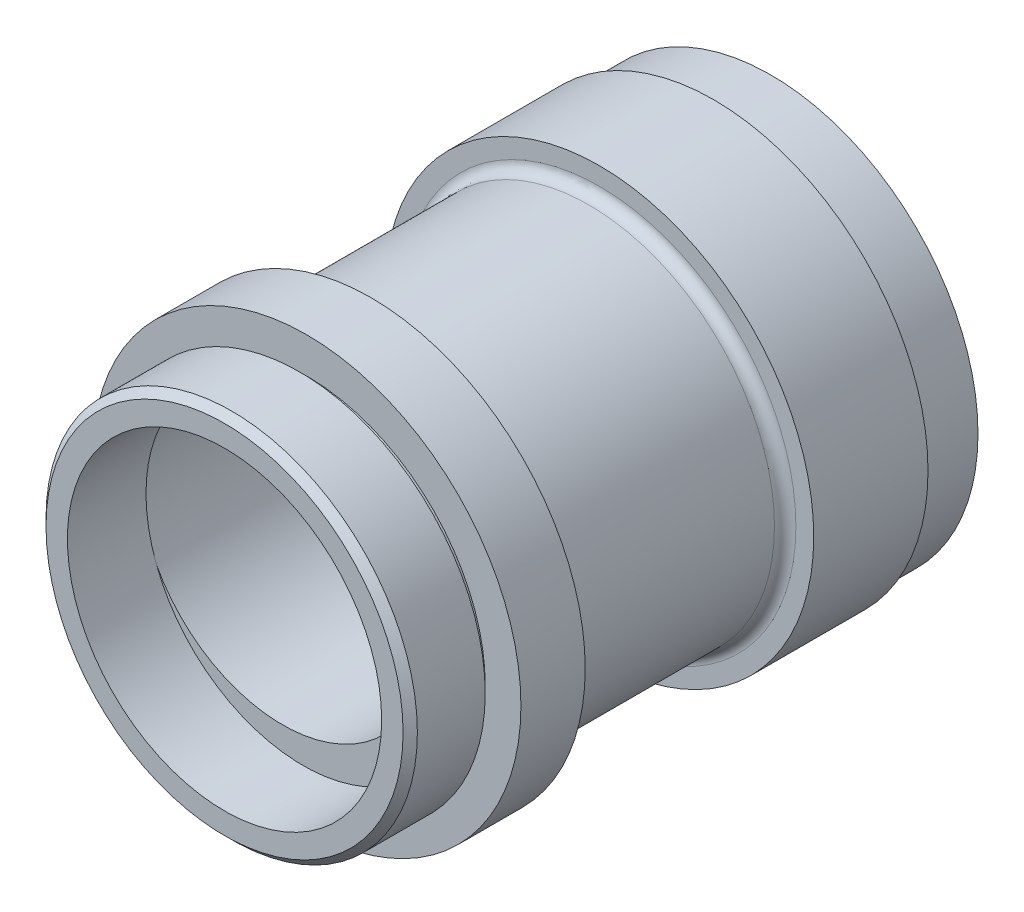
ISO-10303-21;
HEADER;
FILE_DESCRIPTION(('STEP AP214'),'2;1');
FILE_NAME('part.step','',(''),(''),'','','');
FILE_SCHEMA(('AUTOMOTIVE_DESIGN { 1 0 10303 214 1 1 1 1 }'));
ENDSEC;
DATA;
#1=APPLICATION_CONTEXT('core data for automotive mechanical design processes');
#2=APPLICATION_PROTOCOL_DEFINITION('international standard','automotive_design',2000,#1);
#3=PRODUCT_CONTEXT('',#1,'mechanical');
#4=PRODUCT('Part','Part','',(#3));
#5=PRODUCT_RELATED_PRODUCT_CATEGORY('part','',(#4));
#6=PRODUCT_DEFINITION_FORMATION('','',#4);
#7=PRODUCT_DEFINITION_CONTEXT('part definition',#1,'design');
#8=PRODUCT_DEFINITION('design','',#6,#7);
#9=PRODUCT_DEFINITION_SHAPE('','',#8);
#10=(LENGTH_UNIT() NAMED_UNIT(*) SI_UNIT(.MILLI.,.METRE.));
#11=(NAMED_UNIT(*) PLANE_ANGLE_UNIT() SI_UNIT($,.RADIAN.));
#12=(NAMED_UNIT(*) SI_UNIT($,.STERADIAN.) SOLID_ANGLE_UNIT());
#13=UNCERTAINTY_MEASURE_WITH_UNIT(LENGTH_MEASURE(1.E-05),#10,'distance_accuracy_value','');
#14=(GEOMETRIC_REPRESENTATION_CONTEXT(3) GLOBAL_UNCERTAINTY_ASSIGNED_CONTEXT((#13)) GLOBAL_UNIT_ASSIGNED_CONTEXT((#10,
#11,#12)) REPRESENTATION_CONTEXT('',''));
#15=CARTESIAN_POINT('',(0.,0.,0.));
#16=DIRECTION('',(0.,0.,1.));
#17=DIRECTION('',(1.,0.,0.));
#18=AXIS2_PLACEMENT_3D('',#15,#16,#17);
#19=CARTESIAN_POINT('',(0.,0.,4.));
#20=DIRECTION('',(0.,0.,-1.));
#21=DIRECTION('',(-1.,0.,0.));
#22=AXIS2_PLACEMENT_3D('',#19,#20,#21);
#23=CYLINDRICAL_SURFACE('',#22,14.5);
#24=CARTESIAN_POINT('',(0.,0.,4.));
#25=DIRECTION('',(0.,0.,1.));
#26=DIRECTION('',(1.,0.,0.));
#27=AXIS2_PLACEMENT_3D('',#24,#25,#26);
#28=CIRCLE('',#27,14.5);
#29=CARTESIAN_POINT('',(14.5,0.,4.));
#30=VERTEX_POINT('',#29);
#31=EDGE_CURVE('E107',#30,#30,#28,.T.);
#32=ORIENTED_EDGE('',*,*,#31,.F.);
#33=EDGE_LOOP('',(#32));
#34=FACE_BOUND('',#33,.T.);
#35=CARTESIAN_POINT('',(0.,0.,0.));
#36=DIRECTION('',(0.,0.,1.));
#37=DIRECTION('',(1.,0.,0.));
#38=AXIS2_PLACEMENT_3D('',#35,#36,#37);
#39=CIRCLE('',#38,14.5);
#40=CARTESIAN_POINT('',(14.5,0.,0.));
#41=VERTEX_POINT('',#40);
#42=EDGE_CURVE('E117',#41,#41,#39,.T.);
#43=ORIENTED_EDGE('',*,*,#42,.T.);
#44=EDGE_LOOP('',(#43));
#45=FACE_BOUND('',#44,.T.);
#46=ADVANCED_FACE('F49',(#34,#45),#23,.T.);
#47=CARTESIAN_POINT('',(0.,0.,0.));
#48=DIRECTION('',(0.,0.,1.));
#49=DIRECTION('',(1.,0.,0.));
#50=AXIS2_PLACEMENT_3D('',#47,#48,#49);
#51=PLANE('',#50);
#52=CARTESIAN_POINT('',(9.5,8.8,0.));
#53=DIRECTION('',(0.,0.,-1.));
#54=DIRECTION('',(-1.,0.,0.));
#55=AXIS2_PLACEMENT_3D('',#52,#53,#54);
#56=CIRCLE('',#55,0.999999999999999);
#57=CARTESIAN_POINT('',(8.5,8.8,0.));
#58=VERTEX_POINT('',#57);
#59=EDGE_CURVE('E81',#58,#58,#56,.T.);
#60=ORIENTED_EDGE('',*,*,#59,.F.);
#61=EDGE_LOOP('',(#60));
#62=FACE_BOUND('',#61,.T.);
#63=CARTESIAN_POINT('',(-1.44,0.75,0.));
#64=DIRECTION('',(0.,0.,1.));
#65=DIRECTION('',(1.,0.,0.));
#66=AXIS2_PLACEMENT_3D('',#63,#64,#65);
#67=CIRCLE('',#66,10.);
#68=CARTESIAN_POINT('',(8.56,0.75,0.));
#69=VERTEX_POINT('',#68);
#70=EDGE_CURVE('E87',#69,#69,#67,.T.);
#71=ORIENTED_EDGE('',*,*,#70,.T.);
#72=EDGE_LOOP('',(#71));
#73=FACE_BOUND('',#72,.T.);
#74=ORIENTED_EDGE('',*,*,#42,.F.);
#75=EDGE_LOOP('',(#74));
#76=FACE_BOUND('',#75,.T.);
#77=ADVANCED_FACE('F151',(#62,#73,#76),#51,.F.);
#78=CARTESIAN_POINT('',(0.,0.,12.));
#79=DIRECTION('',(0.,0.,-1.));
#80=DIRECTION('',(-1.,0.,0.));
#81=AXIS2_PLACEMENT_3D('',#78,#79,#80);
#82=CYLINDRICAL_SURFACE('',#81,15.);
#83=CARTESIAN_POINT('',(0.,0.,12.));
#84=DIRECTION('',(0.,0.,1.));
#85=DIRECTION('',(1.,0.,0.));
#86=AXIS2_PLACEMENT_3D('',#83,#84,#85);
#87=CIRCLE('',#86,15.);
#88=CARTESIAN_POINT('',(15.,0.,12.));
#89=VERTEX_POINT('',#88);
#90=EDGE_CURVE('E114',#89,#89,#87,.T.);
#91=ORIENTED_EDGE('',*,*,#90,.F.);
#92=EDGE_LOOP('',(#91));
#93=FACE_BOUND('',#92,.T.);
#94=CARTESIAN_POINT('',(0.,0.,4.));
#95=DIRECTION('',(0.,0.,1.));
#96=DIRECTION('',(1.,0.,0.));
#97=AXIS2_PLACEMENT_3D('',#94,#95,#96);
#98=CIRCLE('',#97,15.);
#99=CARTESIAN_POINT('',(15.,0.,4.));
#100=VERTEX_POINT('',#99);
#101=EDGE_CURVE('E111',#100,#100,#98,.T.);
#102=ORIENTED_EDGE('',*,*,#101,.T.);
#103=EDGE_LOOP('',(#102));
#104=FACE_BOUND('',#103,.T.);
#105=ADVANCED_FACE('F158',(#93,#104),#82,.T.);
#106=CARTESIAN_POINT('',(0.,0.,12.));
#107=DIRECTION('',(0.,0.,1.));
#108=DIRECTION('',(1.,0.,0.));
#109=AXIS2_PLACEMENT_3D('',#106,#107,#108);
#110=PLANE('',#109);
#111=CARTESIAN_POINT('',(0.,0.,12.));
#112=DIRECTION('',(0.,0.,1.));
#113=DIRECTION('',(1.,0.,0.));
#114=AXIS2_PLACEMENT_3D('',#111,#112,#113);
#115=CIRCLE('',#114,13.75);
#116=CARTESIAN_POINT('',(13.75,0.,12.));
#117=VERTEX_POINT('',#116);
#118=EDGE_CURVE('E129',#117,#117,#115,.F.);
#119=ORIENTED_EDGE('',*,*,#118,.T.);
#120=EDGE_LOOP('',(#119));
#121=FACE_BOUND('',#120,.T.);
#122=ORIENTED_EDGE('',*,*,#90,.T.);
#123=EDGE_LOOP('',(#122));
#124=FACE_BOUND('',#123,.T.);
#125=ADVANCED_FACE('F207',(#121,#124),#110,.T.);
#126=CARTESIAN_POINT('',(0.,0.,4.));
#127=DIRECTION('',(0.,0.,1.));
#128=DIRECTION('',(1.,0.,0.));
#129=AXIS2_PLACEMENT_3D('',#126,#127,#128);
#130=PLANE('',#129);
#131=ORIENTED_EDGE('',*,*,#31,.T.);
#132=EDGE_LOOP('',(#131));
#133=FACE_BOUND('',#132,.T.);
#134=ORIENTED_EDGE('',*,*,#101,.F.);
#135=EDGE_LOOP('',(#134));
#136=FACE_BOUND('',#135,.T.);
#137=ADVANCED_FACE('F183',(#133,#136),#130,.F.);
#138=CARTESIAN_POINT('',(0.,0.,28.));
#139=DIRECTION('',(0.,0.,-1.));
#140=DIRECTION('',(-1.,0.,0.));
#141=AXIS2_PLACEMENT_3D('',#138,#139,#140);
#142=CYLINDRICAL_SURFACE('',#141,13.);
#143=CARTESIAN_POINT('',(0.,0.,12.75));
#144=DIRECTION('',(0.,0.,1.));
#145=DIRECTION('',(1.,0.,0.));
#146=AXIS2_PLACEMENT_3D('',#143,#144,#145);
#147=CIRCLE('',#146,13.);
#148=CARTESIAN_POINT('',(13.,0.,12.75));
#149=VERTEX_POINT('',#148);
#150=EDGE_CURVE('E126',#149,#149,#147,.T.);
#151=ORIENTED_EDGE('',*,*,#150,.T.);
#152=EDGE_LOOP('',(#151));
#153=FACE_BOUND('',#152,.T.);
#154=CARTESIAN_POINT('',(0.,0.,27.25));
#155=DIRECTION('',(0.,0.,1.));
#156=DIRECTION('',(1.,0.,0.));
#157=AXIS2_PLACEMENT_3D('',#154,#155,#156);
#158=CIRCLE('',#157,13.);
#159=CARTESIAN_POINT('',(13.,0.,27.25));
#160=VERTEX_POINT('',#159);
#161=EDGE_CURVE('E106',#160,#160,#158,.F.);
#162=ORIENTED_EDGE('',*,*,#161,.T.);
#163=EDGE_LOOP('',(#162));
#164=FACE_BOUND('',#163,.T.);
#165=ADVANCED_FACE('F179',(#153,#164),#142,.T.);
#166=CARTESIAN_POINT('',(0.,0.,32.5));
#167=DIRECTION('',(0.,0.,-1.));
#168=DIRECTION('',(-1.,0.,0.));
#169=AXIS2_PLACEMENT_3D('',#166,#167,#168);
#170=CYLINDRICAL_SURFACE('',#169,15.);
#171=CARTESIAN_POINT('',(0.,0.,32.5));
#172=DIRECTION('',(0.,0.,1.));
#173=DIRECTION('',(1.,0.,0.));
#174=AXIS2_PLACEMENT_3D('',#171,#172,#173);
#175=CIRCLE('',#174,15.);
#176=CARTESIAN_POINT('',(15.,0.,32.5));
#177=VERTEX_POINT('',#176);
#178=EDGE_CURVE('E108',#177,#177,#175,.T.);
#179=ORIENTED_EDGE('',*,*,#178,.F.);
#180=EDGE_LOOP('',(#179));
#181=FACE_BOUND('',#180,.T.);
#182=CARTESIAN_POINT('',(0.,0.,28.));
#183=DIRECTION('',(0.,0.,1.));
#184=DIRECTION('',(1.,0.,0.));
#185=AXIS2_PLACEMENT_3D('',#182,#183,#184);
#186=CIRCLE('',#185,15.);
#187=CARTESIAN_POINT('',(15.,0.,28.));
#188=VERTEX_POINT('',#187);
#189=EDGE_CURVE('E102',#188,#188,#186,.T.);
#190=ORIENTED_EDGE('',*,*,#189,.T.);
#191=EDGE_LOOP('',(#190));
#192=FACE_BOUND('',#191,.T.);
#193=ADVANCED_FACE('F182',(#181,#192),#170,.T.);
#194=CARTESIAN_POINT('',(0.,0.,32.5));
#195=DIRECTION('',(0.,0.,1.));
#196=DIRECTION('',(1.,0.,0.));
#197=AXIS2_PLACEMENT_3D('',#194,#195,#196);
#198=PLANE('',#197);
#199=CARTESIAN_POINT('',(0.,0.,32.5));
#200=DIRECTION('',(0.,0.,1.));
#201=DIRECTION('',(1.,0.,0.));
#202=AXIS2_PLACEMENT_3D('',#199,#200,#201);
#203=CIRCLE('',#202,12.5);
#204=CARTESIAN_POINT('',(12.5,0.,32.5));
#205=VERTEX_POINT('',#204);
#206=EDGE_CURVE('E103',#205,#205,#203,.T.);
#207=ORIENTED_EDGE('',*,*,#206,.F.);
#208=EDGE_LOOP('',(#207));
#209=FACE_BOUND('',#208,.T.);
#210=ORIENTED_EDGE('',*,*,#178,.T.);
#211=EDGE_LOOP('',(#210));
#212=FACE_BOUND('',#211,.T.);
#213=ADVANCED_FACE('F192',(#209,#212),#198,.T.);
#214=CARTESIAN_POINT('',(0.,0.,28.));
#215=DIRECTION('',(0.,0.,1.));
#216=DIRECTION('',(1.,0.,0.));
#217=AXIS2_PLACEMENT_3D('',#214,#215,#216);
#218=PLANE('',#217);
#219=CARTESIAN_POINT('',(0.,0.,28.));
#220=DIRECTION('',(0.,0.,1.));
#221=DIRECTION('',(1.,0.,0.));
#222=AXIS2_PLACEMENT_3D('',#219,#220,#221);
#223=CIRCLE('',#222,13.75);
#224=CARTESIAN_POINT('',(13.75,0.,28.));
#225=VERTEX_POINT('',#224);
#226=EDGE_CURVE('E132',#225,#225,#223,.T.);
#227=ORIENTED_EDGE('',*,*,#226,.T.);
#228=EDGE_LOOP('',(#227));
#229=FACE_BOUND('',#228,.T.);
#230=ORIENTED_EDGE('',*,*,#189,.F.);
#231=EDGE_LOOP('',(#230));
#232=FACE_BOUND('',#231,.T.);
#233=ADVANCED_FACE('F189',(#229,#232),#218,.F.);
#234=CARTESIAN_POINT('',(0.,0.,33.));
#235=DIRECTION('',(0.,0.,-1.));
#236=DIRECTION('',(-1.,0.,0.));
#237=AXIS2_PLACEMENT_3D('',#234,#235,#236);
#238=CYLINDRICAL_SURFACE('',#237,12.5);
#239=CARTESIAN_POINT('',(0.,0.,33.));
#240=DIRECTION('',(0.,0.,1.));
#241=DIRECTION('',(1.,0.,0.));
#242=AXIS2_PLACEMENT_3D('',#239,#240,#241);
#243=CIRCLE('',#242,12.5);
#244=CARTESIAN_POINT('',(12.5,0.,33.));
#245=VERTEX_POINT('',#244);
#246=EDGE_CURVE('E99',#245,#245,#243,.T.);
#247=ORIENTED_EDGE('',*,*,#246,.F.);
#248=EDGE_LOOP('',(#247));
#249=FACE_BOUND('',#248,.T.);
#250=ORIENTED_EDGE('',*,*,#206,.T.);
#251=EDGE_LOOP('',(#250));
#252=FACE_BOUND('',#251,.T.);
#253=ADVANCED_FACE('F191',(#249,#252),#238,.T.);
#254=CARTESIAN_POINT('',(0.,0.,38.25));
#255=DIRECTION('',(0.,0.,-1.));
#256=DIRECTION('',(-1.,0.,0.));
#257=AXIS2_PLACEMENT_3D('',#254,#255,#256);
#258=CYLINDRICAL_SURFACE('',#257,13.);
#259=CARTESIAN_POINT('',(0.,0.,37.75));
#260=DIRECTION('',(0.,0.,1.));
#261=DIRECTION('',(1.,0.,0.));
#262=AXIS2_PLACEMENT_3D('',#259,#260,#261);
#263=CIRCLE('',#262,13.);
#264=CARTESIAN_POINT('',(-13.,0.,37.75));
#265=VERTEX_POINT('',#264);
#266=EDGE_CURVE('E11',#265,#265,#263,.F.);
#267=CARTESIAN_POINT('',(0.,0.,33.));
#268=DIRECTION('',(0.,0.,1.));
#269=DIRECTION('',(1.,0.,0.));
#270=AXIS2_PLACEMENT_3D('',#267,#268,#269);
#271=CIRCLE('',#270,13.);
#272=CARTESIAN_POINT('',(-13.,0.,33.));
#273=VERTEX_POINT('',#272);
#274=EDGE_CURVE('E93',#273,#273,#271,.T.);
#275=CARTESIAN_POINT('',(-13.,0.,37.75));
#276=CARTESIAN_POINT('',(-13.,0.,37.7005208333334));
#277=CARTESIAN_POINT('',(-13.,0.,37.6510416666667));
#278=CARTESIAN_POINT('',(-13.,0.,37.5520833333334));
#279=CARTESIAN_POINT('',(-13.,0.,37.5026041666667));
#280=CARTESIAN_POINT('',(-13.,0.,37.4036458333334));
#281=CARTESIAN_POINT('',(-13.,0.,37.3541666666667));
#282=CARTESIAN_POINT('',(-13.,0.,37.2552083333334));
#283=CARTESIAN_POINT('',(-13.,0.,37.2057291666667));
#284=CARTESIAN_POINT('',(-13.,0.,37.1067708333334));
#285=CARTESIAN_POINT('',(-13.,0.,37.0572916666667));
#286=CARTESIAN_POINT('',(-13.,0.,36.9583333333334));
#287=CARTESIAN_POINT('',(-13.,0.,36.9088541666667));
#288=CARTESIAN_POINT('',(-13.,0.,36.8098958333334));
#289=CARTESIAN_POINT('',(-13.,0.,36.7604166666667));
#290=CARTESIAN_POINT('',(-13.,0.,36.6614583333334));
#291=CARTESIAN_POINT('',(-13.,0.,36.6119791666667));
#292=CARTESIAN_POINT('',(-13.,0.,36.5130208333334));
#293=CARTESIAN_POINT('',(-13.,0.,36.4635416666667));
#294=CARTESIAN_POINT('',(-13.,0.,36.3645833333333));
#295=CARTESIAN_POINT('',(-13.,0.,36.3151041666667));
#296=CARTESIAN_POINT('',(-13.,0.,36.2161458333333));
#297=CARTESIAN_POINT('',(-13.,0.,36.1666666666667));
#298=CARTESIAN_POINT('',(-13.,0.,36.0677083333333));
#299=CARTESIAN_POINT('',(-13.,0.,36.0182291666667));
#300=CARTESIAN_POINT('',(-13.,0.,35.9192708333333));
#301=CARTESIAN_POINT('',(-13.,0.,35.8697916666667));
#302=CARTESIAN_POINT('',(-13.,0.,35.7708333333333));
#303=CARTESIAN_POINT('',(-13.,0.,35.7213541666667));
#304=CARTESIAN_POINT('',(-13.,0.,35.6223958333333));
#305=CARTESIAN_POINT('',(-13.,0.,35.5729166666667));
#306=CARTESIAN_POINT('',(-13.,0.,35.4739583333333));
#307=CARTESIAN_POINT('',(-13.,0.,35.4244791666667));
#308=CARTESIAN_POINT('',(-13.,0.,35.3255208333333));
#309=CARTESIAN_POINT('',(-13.,0.,35.2760416666667));
#310=CARTESIAN_POINT('',(-13.,0.,35.1770833333333));
#311=CARTESIAN_POINT('',(-13.,0.,35.1276041666667));
#312=CARTESIAN_POINT('',(-13.,0.,35.0286458333333));
#313=CARTESIAN_POINT('',(-13.,0.,34.9791666666667));
#314=CARTESIAN_POINT('',(-13.,0.,34.8802083333333));
#315=CARTESIAN_POINT('',(-13.,0.,34.8307291666667));
#316=CARTESIAN_POINT('',(-13.,0.,34.7317708333333));
#317=CARTESIAN_POINT('',(-13.,0.,34.6822916666667));
#318=CARTESIAN_POINT('',(-13.,0.,34.5833333333333));
#319=CARTESIAN_POINT('',(-13.,0.,34.5338541666667));
#320=CARTESIAN_POINT('',(-13.,0.,34.4348958333333));
#321=CARTESIAN_POINT('',(-13.,0.,34.3854166666667));
#322=CARTESIAN_POINT('',(-13.,0.,34.2864583333333));
#323=CARTESIAN_POINT('',(-13.,0.,34.2369791666667));
#324=CARTESIAN_POINT('',(-13.,0.,34.1380208333333));
#325=CARTESIAN_POINT('',(-13.,0.,34.0885416666667));
#326=CARTESIAN_POINT('',(-13.,0.,33.9895833333333));
#327=CARTESIAN_POINT('',(-13.,0.,33.9401041666667));
#328=CARTESIAN_POINT('',(-13.,0.,33.8411458333333));
#329=CARTESIAN_POINT('',(-13.,0.,33.7916666666667));
#330=CARTESIAN_POINT('',(-13.,0.,33.6927083333333));
#331=CARTESIAN_POINT('',(-13.,0.,33.6432291666667));
#332=CARTESIAN_POINT('',(-13.,0.,33.5442708333333));
#333=CARTESIAN_POINT('',(-13.,0.,33.4947916666667));
#334=CARTESIAN_POINT('',(-13.,0.,33.3958333333333));
#335=CARTESIAN_POINT('',(-13.,0.,33.3463541666667));
#336=CARTESIAN_POINT('',(-13.,0.,33.2473958333333));
#337=CARTESIAN_POINT('',(-13.,0.,33.1979166666667));
#338=CARTESIAN_POINT('',(-13.,0.,33.0989583333333));
#339=CARTESIAN_POINT('',(-13.,0.,33.0494791666667));
#340=CARTESIAN_POINT('',(-13.,0.,33.));
#341=B_SPLINE_CURVE_WITH_KNOTS('',3,(#275,#276,#277,#278,#279,#280,#281,#282,#283,#284,#285,
#286,#287,#288,#289,#290,#291,#292,#293,#294,#295,#296,#297,#298,#299,#300,#301,#302,#303,#304,
#305,#306,#307,#308,#309,#310,#311,#312,#313,#314,#315,#316,#317,#318,#319,#320,#321,#322,#323,
#324,#325,#326,#327,#328,#329,#330,#331,#332,#333,#334,#335,#336,#337,#338,#339,#340),
.UNSPECIFIED.,.F.,.F.,(4,2,2,2,2,2,2,2,2,2,2,2,2,2,2,2,2,2,2,2,2,2,2,2,2,2,2,2,2,2,2,2,4),(0.,
0.148437500000001,0.296875000000002,0.445312500000003,0.593750000000004,0.742187500000005,
0.890625000000006,1.03906250000001,1.18750000000001,1.33593750000001,1.48437500000001,
1.63281250000001,1.78125000000001,1.92968750000001,2.07812500000001,2.22656250000002,
2.37500000000002,2.52343750000002,2.67187500000002,2.82031250000002,2.96875000000002,
3.11718750000002,3.26562500000002,3.41406250000002,3.56250000000002,3.71093750000002,
3.85937500000003,4.00781250000003,4.15625000000003,4.30468750000003,4.45312500000003,
4.60156250000003,4.75000000000003),.UNSPECIFIED.);
#342=EDGE_CURVE('BSEAM262',#265,#273,#341,.T.);
#343=ORIENTED_EDGE('',*,*,#266,.T.);
#344=ORIENTED_EDGE('',*,*,#274,.T.);
#345=ORIENTED_EDGE('',*,*,#342,.T.);
#346=ORIENTED_EDGE('',*,*,#342,.F.);
#347=EDGE_LOOP('',(#343,#345,#344,#346));
#348=FACE_BOUND('',#347,.T.);
#349=ADVANCED_FACE('F262',(#348),#258,.T.);
#350=CARTESIAN_POINT('',(0.,0.,38.25));
#351=DIRECTION('',(0.,0.,1.));
#352=DIRECTION('',(1.,0.,0.));
#353=AXIS2_PLACEMENT_3D('',#350,#351,#352);
#354=PLANE('',#353);
#355=CARTESIAN_POINT('',(0.,0.,38.25));
#356=DIRECTION('',(0.,0.,1.));
#357=DIRECTION('',(1.,0.,0.));
#358=AXIS2_PLACEMENT_3D('',#355,#356,#357);
#359=CIRCLE('',#358,12.5);
#360=CARTESIAN_POINT('',(12.5,0.,38.25));
#361=VERTEX_POINT('',#360);
#362=EDGE_CURVE('E58',#361,#361,#359,.T.);
#363=ORIENTED_EDGE('',*,*,#362,.T.);
#364=EDGE_LOOP('',(#363));
#365=FACE_BOUND('',#364,.T.);
#366=CARTESIAN_POINT('',(0.,0.,38.25));
#367=DIRECTION('',(0.,0.,1.));
#368=DIRECTION('',(1.,0.,0.));
#369=AXIS2_PLACEMENT_3D('',#366,#367,#368);
#370=CIRCLE('',#369,11.);
#371=CARTESIAN_POINT('',(11.,0.,38.25));
#372=VERTEX_POINT('',#371);
#373=EDGE_CURVE('E89',#372,#372,#370,.T.);
#374=ORIENTED_EDGE('',*,*,#373,.F.);
#375=EDGE_LOOP('',(#374));
#376=FACE_BOUND('',#375,.T.);
#377=ADVANCED_FACE('F137',(#365,#376),#354,.T.);
#378=CARTESIAN_POINT('',(0.,0.,33.));
#379=DIRECTION('',(0.,0.,1.));
#380=DIRECTION('',(1.,0.,0.));
#381=AXIS2_PLACEMENT_3D('',#378,#379,#380);
#382=PLANE('',#381);
#383=ORIENTED_EDGE('',*,*,#246,.T.);
#384=EDGE_LOOP('',(#383));
#385=FACE_BOUND('',#384,.T.);
#386=ORIENTED_EDGE('',*,*,#274,.F.);
#387=EDGE_LOOP('',(#386));
#388=FACE_BOUND('',#387,.T.);
#389=ADVANCED_FACE('F284',(#385,#388),#382,.F.);
#390=CARTESIAN_POINT('',(0.,0.,32.75));
#391=DIRECTION('',(0.,0.,1.));
#392=DIRECTION('',(1.,0.,0.));
#393=AXIS2_PLACEMENT_3D('',#390,#391,#392);
#394=CYLINDRICAL_SURFACE('',#393,11.);
#395=CARTESIAN_POINT('',(0.,0.,32.75));
#396=DIRECTION('',(0.,0.,1.));
#397=DIRECTION('',(1.,0.,0.));
#398=AXIS2_PLACEMENT_3D('',#395,#396,#397);
#399=CIRCLE('',#398,11.);
#400=CARTESIAN_POINT('',(-2.64603790001168,10.6770072319776,32.75));
#401=VERTEX_POINT('',#400);
#402=CARTESIAN_POINT('',(-10.2654540767722,-3.95227182740265,32.75));
#403=VERTEX_POINT('',#402);
#404=EDGE_CURVE('E91',#401,#403,#399,.T.);
#405=ORIENTED_EDGE('',*,*,#404,.F.);
#406=EDGE_CURVE('E94',#403,#401,#399,.T.);
#407=ORIENTED_EDGE('',*,*,#406,.F.);
#408=EDGE_LOOP('',(#405,#407));
#409=FACE_BOUND('',#408,.T.);
#410=ORIENTED_EDGE('',*,*,#373,.T.);
#411=EDGE_LOOP('',(#410));
#412=FACE_BOUND('',#411,.T.);
#413=ADVANCED_FACE('F293',(#409,#412),#394,.F.);
#414=CARTESIAN_POINT('',(0.,0.,32.75));
#415=DIRECTION('',(0.,0.,1.));
#416=DIRECTION('',(1.,0.,0.));
#417=AXIS2_PLACEMENT_3D('',#414,#415,#416);
#418=PLANE('',#417);
#419=CARTESIAN_POINT('',(-1.44,0.75,32.75));
#420=DIRECTION('',(0.,0.,1.));
#421=DIRECTION('',(1.,0.,0.));
#422=AXIS2_PLACEMENT_3D('',#419,#420,#421);
#423=CIRCLE('',#422,10.);
#424=EDGE_CURVE('E68',#403,#401,#423,.T.);
#425=ORIENTED_EDGE('',*,*,#424,.F.);
#426=ORIENTED_EDGE('',*,*,#406,.T.);
#427=EDGE_LOOP('',(#425,#426));
#428=FACE_BOUND('',#427,.T.);
#429=ADVANCED_FACE('F303',(#428),#418,.T.);
#430=CARTESIAN_POINT('',(-1.44,0.75,0.));
#431=DIRECTION('',(0.,0.,1.));
#432=DIRECTION('',(1.,0.,0.));
#433=AXIS2_PLACEMENT_3D('',#430,#431,#432);
#434=CYLINDRICAL_SURFACE('',#433,10.);
#435=ORIENTED_EDGE('',*,*,#70,.F.);
#436=EDGE_LOOP('',(#435));
#437=FACE_BOUND('',#436,.T.);
#438=EDGE_CURVE('E64',#401,#403,#423,.T.);
#439=ORIENTED_EDGE('',*,*,#438,.T.);
#440=ORIENTED_EDGE('',*,*,#424,.T.);
#441=EDGE_LOOP('',(#439,#440));
#442=FACE_BOUND('',#441,.T.);
#443=ADVANCED_FACE('F172',(#437,#442),#434,.F.);
#444=CARTESIAN_POINT('',(-1.44,0.75,32.75));
#445=DIRECTION('',(0.,0.,1.));
#446=DIRECTION('',(1.,0.,0.));
#447=AXIS2_PLACEMENT_3D('',#444,#445,#446);
#448=PLANE('',#447);
#449=ORIENTED_EDGE('',*,*,#404,.T.);
#450=ORIENTED_EDGE('',*,*,#438,.F.);
#451=EDGE_LOOP('',(#449,#450));
#452=FACE_BOUND('',#451,.T.);
#453=ADVANCED_FACE('F166',(#452),#448,.F.);
#454=CARTESIAN_POINT('',(0.,0.,12.75));
#455=DIRECTION('',(0.,0.,1.));
#456=DIRECTION('',(1.,0.,0.));
#457=AXIS2_PLACEMENT_3D('',#454,#455,#456);
#458=TOROIDAL_SURFACE('',#457,13.75,0.75);
#459=ORIENTED_EDGE('',*,*,#118,.F.);
#460=EDGE_LOOP('',(#459));
#461=FACE_BOUND('',#460,.T.);
#462=ORIENTED_EDGE('',*,*,#150,.F.);
#463=EDGE_LOOP('',(#462));
#464=FACE_BOUND('',#463,.T.);
#465=ADVANCED_FACE('F147',(#461,#464),#458,.F.);
#466=CARTESIAN_POINT('',(0.,0.,27.25));
#467=DIRECTION('',(0.,0.,1.));
#468=DIRECTION('',(1.,0.,0.));
#469=AXIS2_PLACEMENT_3D('',#466,#467,#468);
#470=TOROIDAL_SURFACE('',#469,13.75,0.75);
#471=ORIENTED_EDGE('',*,*,#161,.F.);
#472=EDGE_LOOP('',(#471));
#473=FACE_BOUND('',#472,.T.);
#474=ORIENTED_EDGE('',*,*,#226,.F.);
#475=EDGE_LOOP('',(#474));
#476=FACE_BOUND('',#475,.T.);
#477=ADVANCED_FACE('F141',(#473,#476),#470,.F.);
#478=CARTESIAN_POINT('',(0.,0.,38.25));
#479=DIRECTION('',(0.,0.,-1.));
#480=DIRECTION('',(-1.,0.,0.));
#481=AXIS2_PLACEMENT_3D('',#478,#479,#480);
#482=CONICAL_SURFACE('',#481,12.5,0.785398163397457);
#483=ORIENTED_EDGE('',*,*,#266,.F.);
#484=EDGE_LOOP('',(#483));
#485=FACE_BOUND('',#484,.T.);
#486=ORIENTED_EDGE('',*,*,#362,.F.);
#487=EDGE_LOOP('',(#486));
#488=FACE_BOUND('',#487,.T.);
#489=ADVANCED_FACE('F52',(#485,#488),#482,.T.);
#490=CARTESIAN_POINT('',(9.5,8.8,8.64913938097244));
#491=DIRECTION('',(0.,0.,-1.));
#492=DIRECTION('',(-1.,0.,0.));
#493=AXIS2_PLACEMENT_3D('',#490,#491,#492);
#494=CONICAL_SURFACE('',#493,0.999999999999997,1.02974425867665);
#495=CARTESIAN_POINT('',(9.5,8.8,9.25));
#496=VERTEX_POINT('',#495);
#497=VERTEX_LOOP('',#496);
#498=FACE_BOUND('',#497,.T.);
#499=CARTESIAN_POINT('',(9.5,8.8,8.64913938097244));
#500=DIRECTION('',(0.,0.,-1.));
#501=DIRECTION('',(-1.,0.,0.));
#502=AXIS2_PLACEMENT_3D('',#499,#500,#501);
#503=CIRCLE('',#502,0.999999999999997);
#504=CARTESIAN_POINT('',(8.5,8.8,8.64913938097244));
#505=VERTEX_POINT('',#504);
#506=EDGE_CURVE('E79',#505,#505,#503,.T.);
#507=ORIENTED_EDGE('',*,*,#506,.T.);
#508=EDGE_LOOP('',(#507));
#509=FACE_BOUND('',#508,.T.);
#510=ADVANCED_FACE('F72',(#498,#509),#494,.F.);
#511=CARTESIAN_POINT('',(9.5,8.8,0.));
#512=DIRECTION('',(0.,0.,-1.));
#513=DIRECTION('',(-1.,0.,0.));
#514=AXIS2_PLACEMENT_3D('',#511,#512,#513);
#515=CYLINDRICAL_SURFACE('',#514,0.999999999999998);
#516=ORIENTED_EDGE('',*,*,#506,.F.);
#517=EDGE_LOOP('',(#516));
#518=FACE_BOUND('',#517,.T.);
#519=ORIENTED_EDGE('',*,*,#59,.T.);
#520=EDGE_LOOP('',(#519));
#521=FACE_BOUND('',#520,.T.);
#522=ADVANCED_FACE('F75',(#518,#521),#515,.F.);
#523=CLOSED_SHELL('',(#46,#77,#105,#125,#137,#165,#193,#213,#233,#253,#349,#377,#389,#413,#429,
#443,#453,#465,#477,#489,#510,#522));
#524=MANIFOLD_SOLID_BREP('B2',#523);
#525=ADVANCED_BREP_SHAPE_REPRESENTATION('',(#18,#524),#14);
#526=SHAPE_DEFINITION_REPRESENTATION(#9,#525);
ENDSEC;
END-ISO-10303-21;
